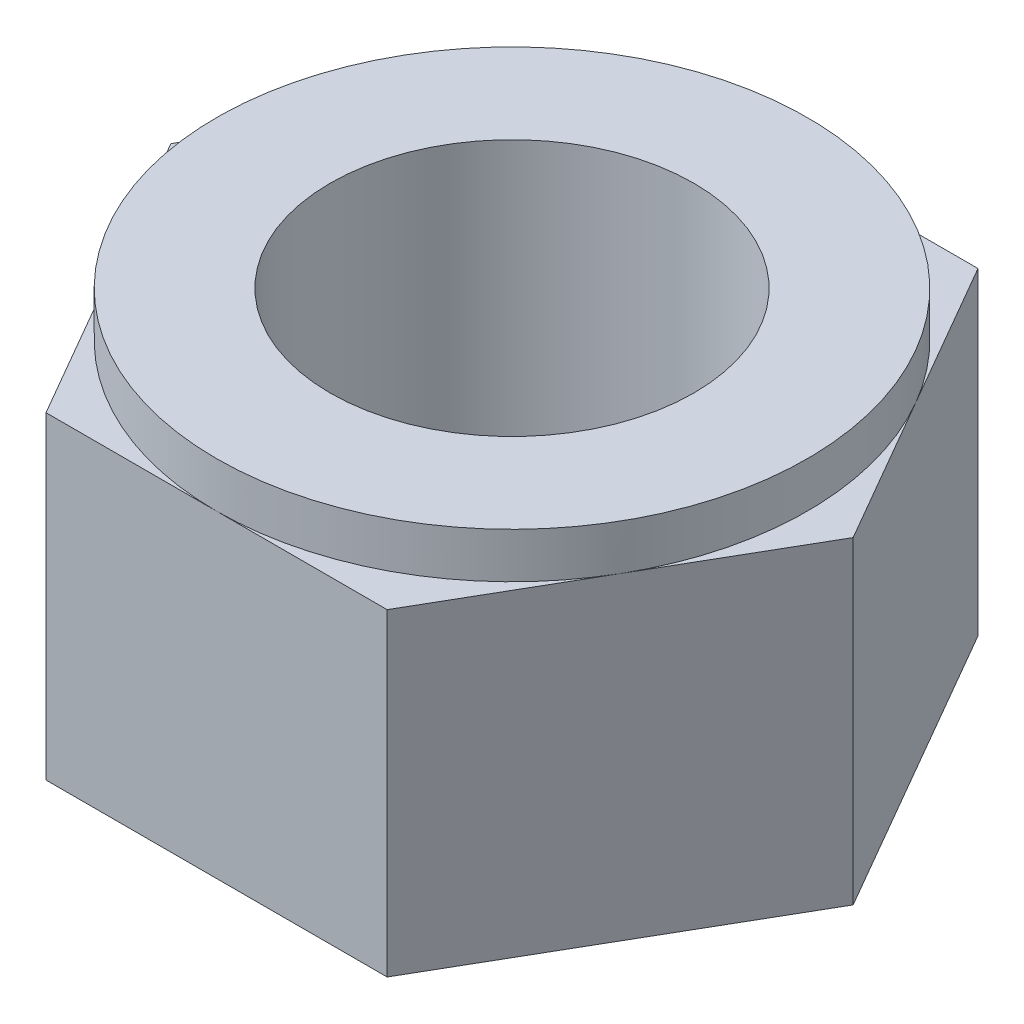
ISO-10303-21;
HEADER;
FILE_DESCRIPTION(('STEP AP214'),'2;1');
FILE_NAME('part.step','',(''),(''),'','','');
FILE_SCHEMA(('AUTOMOTIVE_DESIGN { 1 0 10303 214 1 1 1 1 }'));
ENDSEC;
DATA;
#1=APPLICATION_CONTEXT('core data for automotive mechanical design processes');
#2=APPLICATION_PROTOCOL_DEFINITION('international standard','automotive_design',2000,#1);
#3=PRODUCT_CONTEXT('',#1,'mechanical');
#4=PRODUCT('Part','Part','',(#3));
#5=PRODUCT_RELATED_PRODUCT_CATEGORY('part','',(#4));
#6=PRODUCT_DEFINITION_FORMATION('','',#4);
#7=PRODUCT_DEFINITION_CONTEXT('part definition',#1,'design');
#8=PRODUCT_DEFINITION('design','',#6,#7);
#9=PRODUCT_DEFINITION_SHAPE('','',#8);
#10=(LENGTH_UNIT() NAMED_UNIT(*) SI_UNIT(.MILLI.,.METRE.));
#11=(NAMED_UNIT(*) PLANE_ANGLE_UNIT() SI_UNIT($,.RADIAN.));
#12=(NAMED_UNIT(*) SI_UNIT($,.STERADIAN.) SOLID_ANGLE_UNIT());
#13=UNCERTAINTY_MEASURE_WITH_UNIT(LENGTH_MEASURE(1.E-05),#10,'distance_accuracy_value','');
#14=(GEOMETRIC_REPRESENTATION_CONTEXT(3) GLOBAL_UNCERTAINTY_ASSIGNED_CONTEXT((#13)) GLOBAL_UNIT_ASSIGNED_CONTEXT((#10,
#11,#12)) REPRESENTATION_CONTEXT('',''));
#15=CARTESIAN_POINT('',(0.,0.,0.));
#16=DIRECTION('',(0.,0.,1.));
#17=DIRECTION('',(1.,0.,0.));
#18=AXIS2_PLACEMENT_3D('',#15,#16,#17);
#19=CARTESIAN_POINT('',(0.,7.,0.));
#20=DIRECTION('',(0.,1.,0.));
#21=DIRECTION('',(0.,0.,1.));
#22=AXIS2_PLACEMENT_3D('',#19,#20,#21);
#23=PLANE('',#22);
#24=CARTESIAN_POINT('',(0.,7.,0.));
#25=DIRECTION('',(0.,1.,0.));
#26=DIRECTION('',(0.,0.,1.));
#27=AXIS2_PLACEMENT_3D('',#24,#25,#26);
#28=CIRCLE('',#27,6.5);
#29=CARTESIAN_POINT('',(0.,7.,6.5));
#30=VERTEX_POINT('',#29);
#31=CARTESIAN_POINT('',(5.62916512459885,7.,3.25));
#32=VERTEX_POINT('',#31);
#33=EDGE_CURVE('E55',#30,#32,#28,.T.);
#34=ORIENTED_EDGE('',*,*,#33,.F.);
#35=DIRECTION('',(1.,0.,0.));
#36=VECTOR('',#35,1.);
#37=CARTESIAN_POINT('',(-3.75277674973257,7.,6.5));
#38=LINE('',#37,#36);
#39=CARTESIAN_POINT('',(3.75277674973257,7.,6.5));
#40=VERTEX_POINT('',#39);
#41=EDGE_CURVE('E126',#30,#40,#38,.T.);
#42=ORIENTED_EDGE('',*,*,#41,.T.);
#43=DIRECTION('',(0.5,0.,-0.866025403784439));
#44=VECTOR('',#43,1.);
#45=CARTESIAN_POINT('',(3.75277674973257,7.,6.5));
#46=LINE('',#45,#44);
#47=EDGE_CURVE('E138',#40,#32,#46,.T.);
#48=ORIENTED_EDGE('',*,*,#47,.T.);
#49=EDGE_LOOP('',(#34,#42,#48));
#50=FACE_BOUND('',#49,.T.);
#51=ADVANCED_FACE('F43',(#50),#23,.T.);
#52=CARTESIAN_POINT('',(5.62916512459885,7.,-3.25));
#53=VERTEX_POINT('',#52);
#54=EDGE_CURVE('E11',#32,#53,#28,.T.);
#55=ORIENTED_EDGE('',*,*,#54,.F.);
#56=CARTESIAN_POINT('',(7.50555349946513,7.,0.));
#57=VERTEX_POINT('',#56);
#58=EDGE_CURVE('E157',#32,#57,#46,.T.);
#59=ORIENTED_EDGE('',*,*,#58,.T.);
#60=DIRECTION('',(-0.5,0.,-0.866025403784438));
#61=VECTOR('',#60,1.);
#62=CARTESIAN_POINT('',(7.50555349946513,7.,0.));
#63=LINE('',#62,#61);
#64=EDGE_CURVE('E158',#57,#53,#63,.T.);
#65=ORIENTED_EDGE('',*,*,#64,.T.);
#66=EDGE_LOOP('',(#55,#59,#65));
#67=FACE_BOUND('',#66,.T.);
#68=ADVANCED_FACE('F259',(#67),#23,.T.);
#69=CARTESIAN_POINT('',(0.,7.,-6.5));
#70=VERTEX_POINT('',#69);
#71=EDGE_CURVE('E53',#53,#70,#28,.T.);
#72=ORIENTED_EDGE('',*,*,#71,.F.);
#73=CARTESIAN_POINT('',(3.75277674973256,7.,-6.5));
#74=VERTEX_POINT('',#73);
#75=EDGE_CURVE('E156',#53,#74,#63,.T.);
#76=ORIENTED_EDGE('',*,*,#75,.T.);
#77=DIRECTION('',(-1.,0.,0.));
#78=VECTOR('',#77,1.);
#79=CARTESIAN_POINT('',(3.75277674973256,7.,-6.5));
#80=LINE('',#79,#78);
#81=EDGE_CURVE('E163',#74,#70,#80,.T.);
#82=ORIENTED_EDGE('',*,*,#81,.T.);
#83=EDGE_LOOP('',(#72,#76,#82));
#84=FACE_BOUND('',#83,.T.);
#85=ADVANCED_FACE('F263',(#84),#23,.T.);
#86=CARTESIAN_POINT('',(-5.62916512459885,7.,-3.25));
#87=VERTEX_POINT('',#86);
#88=EDGE_CURVE('E148',#70,#87,#28,.T.);
#89=ORIENTED_EDGE('',*,*,#88,.F.);
#90=CARTESIAN_POINT('',(-3.75277674973257,7.,-6.5));
#91=VERTEX_POINT('',#90);
#92=EDGE_CURVE('E162',#70,#91,#80,.T.);
#93=ORIENTED_EDGE('',*,*,#92,.T.);
#94=DIRECTION('',(-0.5,0.,0.866025403784439));
#95=VECTOR('',#94,1.);
#96=CARTESIAN_POINT('',(-3.75277674973257,7.,-6.5));
#97=LINE('',#96,#95);
#98=EDGE_CURVE('E168',#91,#87,#97,.T.);
#99=ORIENTED_EDGE('',*,*,#98,.T.);
#100=EDGE_LOOP('',(#89,#93,#99));
#101=FACE_BOUND('',#100,.T.);
#102=ADVANCED_FACE('F310',(#101),#23,.T.);
#103=CARTESIAN_POINT('',(-5.62916512459885,7.,3.25));
#104=VERTEX_POINT('',#103);
#105=EDGE_CURVE('E70',#87,#104,#28,.T.);
#106=ORIENTED_EDGE('',*,*,#105,.F.);
#107=CARTESIAN_POINT('',(-7.50555349946513,7.,0.));
#108=VERTEX_POINT('',#107);
#109=EDGE_CURVE('E167',#87,#108,#97,.T.);
#110=ORIENTED_EDGE('',*,*,#109,.T.);
#111=DIRECTION('',(0.5,0.,0.866025403784439));
#112=VECTOR('',#111,1.);
#113=CARTESIAN_POINT('',(-7.50555349946513,7.,0.));
#114=LINE('',#113,#112);
#115=EDGE_CURVE('E136',#108,#104,#114,.T.);
#116=ORIENTED_EDGE('',*,*,#115,.T.);
#117=EDGE_LOOP('',(#106,#110,#116));
#118=FACE_BOUND('',#117,.T.);
#119=ADVANCED_FACE('F229',(#118),#23,.T.);
#120=CARTESIAN_POINT('',(3.75277674973257,7.,6.5));
#121=DIRECTION('',(-0.866025403784439,0.,-0.5));
#122=DIRECTION('',(-0.5,0.,0.866025403784439));
#123=AXIS2_PLACEMENT_3D('',#120,#121,#122);
#124=PLANE('',#123);
#125=DIRECTION('',(0.5,0.,-0.866025403784439));
#126=VECTOR('',#125,1.);
#127=CARTESIAN_POINT('',(3.75277674973257,0.,6.5));
#128=LINE('',#127,#126);
#129=CARTESIAN_POINT('',(3.75277674973257,0.,6.5));
#130=VERTEX_POINT('',#129);
#131=CARTESIAN_POINT('',(7.50555349946513,0.,0.));
#132=VERTEX_POINT('',#131);
#133=EDGE_CURVE('E174',#130,#132,#128,.T.);
#134=ORIENTED_EDGE('',*,*,#133,.T.);
#135=DIRECTION('',(0.,-1.,0.));
#136=VECTOR('',#135,1.);
#137=CARTESIAN_POINT('',(7.50555349946513,7.,0.));
#138=LINE('',#137,#136);
#139=EDGE_CURVE('E47',#57,#132,#138,.T.);
#140=ORIENTED_EDGE('',*,*,#139,.F.);
#141=ORIENTED_EDGE('',*,*,#58,.F.);
#142=ORIENTED_EDGE('',*,*,#47,.F.);
#143=DIRECTION('',(0.,-1.,0.));
#144=VECTOR('',#143,1.);
#145=CARTESIAN_POINT('',(3.75277674973257,7.,6.5));
#146=LINE('',#145,#144);
#147=EDGE_CURVE('E125',#40,#130,#146,.T.);
#148=ORIENTED_EDGE('',*,*,#147,.T.);
#149=EDGE_LOOP('',(#134,#140,#141,#142,#148));
#150=FACE_BOUND('',#149,.T.);
#151=ADVANCED_FACE('F45',(#150),#124,.F.);
#152=CARTESIAN_POINT('',(7.50555349946513,7.,0.));
#153=DIRECTION('',(-0.866025403784438,0.,0.5));
#154=DIRECTION('',(0.5,0.,0.866025403784438));
#155=AXIS2_PLACEMENT_3D('',#152,#153,#154);
#156=PLANE('',#155);
#157=DIRECTION('',(-0.5,0.,-0.866025403784438));
#158=VECTOR('',#157,1.);
#159=CARTESIAN_POINT('',(7.50555349946513,0.,0.));
#160=LINE('',#159,#158);
#161=CARTESIAN_POINT('',(3.75277674973256,0.,-6.5));
#162=VERTEX_POINT('',#161);
#163=EDGE_CURVE('E178',#132,#162,#160,.T.);
#164=ORIENTED_EDGE('',*,*,#163,.T.);
#165=DIRECTION('',(0.,-1.,0.));
#166=VECTOR('',#165,1.);
#167=CARTESIAN_POINT('',(3.75277674973256,7.,-6.5));
#168=LINE('',#167,#166);
#169=EDGE_CURVE('E150',#74,#162,#168,.T.);
#170=ORIENTED_EDGE('',*,*,#169,.F.);
#171=ORIENTED_EDGE('',*,*,#75,.F.);
#172=ORIENTED_EDGE('',*,*,#64,.F.);
#173=ORIENTED_EDGE('',*,*,#139,.T.);
#174=EDGE_LOOP('',(#164,#170,#171,#172,#173));
#175=FACE_BOUND('',#174,.T.);
#176=ADVANCED_FACE('F360',(#175),#156,.F.);
#177=CARTESIAN_POINT('',(3.75277674973256,7.,-6.5));
#178=DIRECTION('',(0.,0.,1.));
#179=DIRECTION('',(1.,0.,0.));
#180=AXIS2_PLACEMENT_3D('',#177,#178,#179);
#181=PLANE('',#180);
#182=DIRECTION('',(-1.,0.,0.));
#183=VECTOR('',#182,1.);
#184=CARTESIAN_POINT('',(3.75277674973256,0.,-6.5));
#185=LINE('',#184,#183);
#186=CARTESIAN_POINT('',(-3.75277674973257,0.,-6.5));
#187=VERTEX_POINT('',#186);
#188=EDGE_CURVE('E181',#162,#187,#185,.T.);
#189=ORIENTED_EDGE('',*,*,#188,.T.);
#190=DIRECTION('',(0.,-1.,0.));
#191=VECTOR('',#190,1.);
#192=CARTESIAN_POINT('',(-3.75277674973257,7.,-6.5));
#193=LINE('',#192,#191);
#194=EDGE_CURVE('E202',#91,#187,#193,.T.);
#195=ORIENTED_EDGE('',*,*,#194,.F.);
#196=ORIENTED_EDGE('',*,*,#92,.F.);
#197=ORIENTED_EDGE('',*,*,#81,.F.);
#198=ORIENTED_EDGE('',*,*,#169,.T.);
#199=EDGE_LOOP('',(#189,#195,#196,#197,#198));
#200=FACE_BOUND('',#199,.T.);
#201=ADVANCED_FACE('F211',(#200),#181,.F.);
#202=CARTESIAN_POINT('',(-3.75277674973257,7.,-6.5));
#203=DIRECTION('',(0.866025403784439,0.,0.5));
#204=DIRECTION('',(0.5,0.,-0.866025403784439));
#205=AXIS2_PLACEMENT_3D('',#202,#203,#204);
#206=PLANE('',#205);
#207=DIRECTION('',(-0.5,0.,0.866025403784439));
#208=VECTOR('',#207,1.);
#209=CARTESIAN_POINT('',(-3.75277674973257,0.,-6.5));
#210=LINE('',#209,#208);
#211=CARTESIAN_POINT('',(-7.50555349946513,0.,0.));
#212=VERTEX_POINT('',#211);
#213=EDGE_CURVE('E184',#187,#212,#210,.T.);
#214=ORIENTED_EDGE('',*,*,#213,.T.);
#215=DIRECTION('',(0.,-1.,0.));
#216=VECTOR('',#215,1.);
#217=CARTESIAN_POINT('',(-7.50555349946513,7.,0.));
#218=LINE('',#217,#216);
#219=EDGE_CURVE('E198',#108,#212,#218,.T.);
#220=ORIENTED_EDGE('',*,*,#219,.F.);
#221=ORIENTED_EDGE('',*,*,#109,.F.);
#222=ORIENTED_EDGE('',*,*,#98,.F.);
#223=ORIENTED_EDGE('',*,*,#194,.T.);
#224=EDGE_LOOP('',(#214,#220,#221,#222,#223));
#225=FACE_BOUND('',#224,.T.);
#226=ADVANCED_FACE('F224',(#225),#206,.F.);
#227=CARTESIAN_POINT('',(-7.50555349946513,7.,0.));
#228=DIRECTION('',(0.866025403784438,0.,-0.5));
#229=DIRECTION('',(-0.5,0.,-0.866025403784439));
#230=AXIS2_PLACEMENT_3D('',#227,#228,#229);
#231=PLANE('',#230);
#232=DIRECTION('',(0.5,0.,0.866025403784439));
#233=VECTOR('',#232,1.);
#234=CARTESIAN_POINT('',(-7.50555349946513,0.,0.));
#235=LINE('',#234,#233);
#236=CARTESIAN_POINT('',(-3.75277674973257,0.,6.5));
#237=VERTEX_POINT('',#236);
#238=EDGE_CURVE('E187',#212,#237,#235,.T.);
#239=ORIENTED_EDGE('',*,*,#238,.T.);
#240=DIRECTION('',(0.,-1.,0.));
#241=VECTOR('',#240,1.);
#242=CARTESIAN_POINT('',(-3.75277674973257,7.,6.5));
#243=LINE('',#242,#241);
#244=CARTESIAN_POINT('',(-3.75277674973257,7.,6.5));
#245=VERTEX_POINT('',#244);
#246=EDGE_CURVE('E195',#245,#237,#243,.T.);
#247=ORIENTED_EDGE('',*,*,#246,.F.);
#248=EDGE_CURVE('E120',#104,#245,#114,.T.);
#249=ORIENTED_EDGE('',*,*,#248,.F.);
#250=ORIENTED_EDGE('',*,*,#115,.F.);
#251=ORIENTED_EDGE('',*,*,#219,.T.);
#252=EDGE_LOOP('',(#239,#247,#249,#250,#251));
#253=FACE_BOUND('',#252,.T.);
#254=ADVANCED_FACE('F228',(#253),#231,.F.);
#255=CARTESIAN_POINT('',(-3.75277674973257,7.,6.5));
#256=DIRECTION('',(0.,0.,-1.));
#257=DIRECTION('',(-1.,0.,0.));
#258=AXIS2_PLACEMENT_3D('',#255,#256,#257);
#259=PLANE('',#258);
#260=DIRECTION('',(1.,0.,0.));
#261=VECTOR('',#260,1.);
#262=CARTESIAN_POINT('',(-3.75277674973257,0.,6.5));
#263=LINE('',#262,#261);
#264=EDGE_CURVE('E190',#237,#130,#263,.T.);
#265=ORIENTED_EDGE('',*,*,#264,.T.);
#266=ORIENTED_EDGE('',*,*,#147,.F.);
#267=ORIENTED_EDGE('',*,*,#41,.F.);
#268=EDGE_CURVE('E117',#245,#30,#38,.T.);
#269=ORIENTED_EDGE('',*,*,#268,.F.);
#270=ORIENTED_EDGE('',*,*,#246,.T.);
#271=EDGE_LOOP('',(#265,#266,#267,#269,#270));
#272=FACE_BOUND('',#271,.T.);
#273=ADVANCED_FACE('F130',(#272),#259,.F.);
#274=EDGE_CURVE('E62',#104,#30,#28,.T.);
#275=ORIENTED_EDGE('',*,*,#274,.F.);
#276=ORIENTED_EDGE('',*,*,#248,.T.);
#277=ORIENTED_EDGE('',*,*,#268,.T.);
#278=EDGE_LOOP('',(#275,#276,#277));
#279=FACE_BOUND('',#278,.T.);
#280=ADVANCED_FACE('F119',(#279),#23,.T.);
#281=CARTESIAN_POINT('',(0.,0.,0.));
#282=DIRECTION('',(0.,1.,0.));
#283=DIRECTION('',(0.,0.,1.));
#284=AXIS2_PLACEMENT_3D('',#281,#282,#283);
#285=PLANE('',#284);
#286=CARTESIAN_POINT('',(0.,0.,0.));
#287=DIRECTION('',(0.,-1.,0.));
#288=DIRECTION('',(0.,0.,-1.));
#289=AXIS2_PLACEMENT_3D('',#286,#287,#288);
#290=CIRCLE('',#289,4.);
#291=CARTESIAN_POINT('',(0.,0.,-4.));
#292=VERTEX_POINT('',#291);
#293=EDGE_CURVE('E240',#292,#292,#290,.T.);
#294=ORIENTED_EDGE('',*,*,#293,.F.);
#295=EDGE_LOOP('',(#294));
#296=FACE_BOUND('',#295,.T.);
#297=ORIENTED_EDGE('',*,*,#133,.F.);
#298=ORIENTED_EDGE('',*,*,#264,.F.);
#299=ORIENTED_EDGE('',*,*,#238,.F.);
#300=ORIENTED_EDGE('',*,*,#213,.F.);
#301=ORIENTED_EDGE('',*,*,#188,.F.);
#302=ORIENTED_EDGE('',*,*,#163,.F.);
#303=EDGE_LOOP('',(#297,#298,#299,#300,#301,#302));
#304=FACE_BOUND('',#303,.T.);
#305=ADVANCED_FACE('F219',(#296,#304),#285,.F.);
#306=CARTESIAN_POINT('',(0.,8.,0.));
#307=DIRECTION('',(0.,-1.,0.));
#308=DIRECTION('',(0.,0.,-1.));
#309=AXIS2_PLACEMENT_3D('',#306,#307,#308);
#310=CYLINDRICAL_SURFACE('',#309,6.5);
#311=CARTESIAN_POINT('',(0.,8.,0.));
#312=DIRECTION('',(0.,1.,0.));
#313=DIRECTION('',(0.,0.,1.));
#314=AXIS2_PLACEMENT_3D('',#311,#312,#313);
#315=CIRCLE('',#314,6.5);
#316=CARTESIAN_POINT('',(0.,8.,6.5));
#317=VERTEX_POINT('',#316);
#318=EDGE_CURVE('E141',#317,#317,#315,.T.);
#319=ORIENTED_EDGE('',*,*,#318,.F.);
#320=EDGE_LOOP('',(#319));
#321=FACE_BOUND('',#320,.T.);
#322=ORIENTED_EDGE('',*,*,#33,.T.);
#323=ORIENTED_EDGE('',*,*,#54,.T.);
#324=ORIENTED_EDGE('',*,*,#71,.T.);
#325=ORIENTED_EDGE('',*,*,#88,.T.);
#326=ORIENTED_EDGE('',*,*,#105,.T.);
#327=ORIENTED_EDGE('',*,*,#274,.T.);
#328=EDGE_LOOP('',(#322,#323,#324,#325,#326,#327));
#329=FACE_BOUND('',#328,.T.);
#330=ADVANCED_FACE('F143',(#321,#329),#310,.T.);
#331=CARTESIAN_POINT('',(0.,8.,0.));
#332=DIRECTION('',(0.,1.,0.));
#333=DIRECTION('',(0.,0.,1.));
#334=AXIS2_PLACEMENT_3D('',#331,#332,#333);
#335=PLANE('',#334);
#336=CARTESIAN_POINT('',(0.,8.,0.));
#337=DIRECTION('',(0.,-1.,0.));
#338=DIRECTION('',(0.,0.,-1.));
#339=AXIS2_PLACEMENT_3D('',#336,#337,#338);
#340=CIRCLE('',#339,4.);
#341=CARTESIAN_POINT('',(0.,8.,-4.));
#342=VERTEX_POINT('',#341);
#343=EDGE_CURVE('E142',#342,#342,#340,.T.);
#344=ORIENTED_EDGE('',*,*,#343,.T.);
#345=EDGE_LOOP('',(#344));
#346=FACE_BOUND('',#345,.T.);
#347=ORIENTED_EDGE('',*,*,#318,.T.);
#348=EDGE_LOOP('',(#347));
#349=FACE_BOUND('',#348,.T.);
#350=ADVANCED_FACE('F253',(#346,#349),#335,.T.);
#351=CARTESIAN_POINT('',(0.,8.,0.));
#352=DIRECTION('',(0.,-1.,0.));
#353=DIRECTION('',(0.,0.,-1.));
#354=AXIS2_PLACEMENT_3D('',#351,#352,#353);
#355=CYLINDRICAL_SURFACE('',#354,4.);
#356=ORIENTED_EDGE('',*,*,#343,.F.);
#357=EDGE_LOOP('',(#356));
#358=FACE_BOUND('',#357,.T.);
#359=ORIENTED_EDGE('',*,*,#293,.T.);
#360=EDGE_LOOP('',(#359));
#361=FACE_BOUND('',#360,.T.);
#362=ADVANCED_FACE('F245',(#358,#361),#355,.F.);
#363=CLOSED_SHELL('',(#51,#68,#85,#102,#119,#151,#176,#201,#226,#254,#273,#280,#305,#330,#350,#362));
#364=MANIFOLD_SOLID_BREP('B2',#363);
#365=ADVANCED_BREP_SHAPE_REPRESENTATION('',(#18,#364),#14);
#366=SHAPE_DEFINITION_REPRESENTATION(#9,#365);
ENDSEC;
END-ISO-10303-21;
